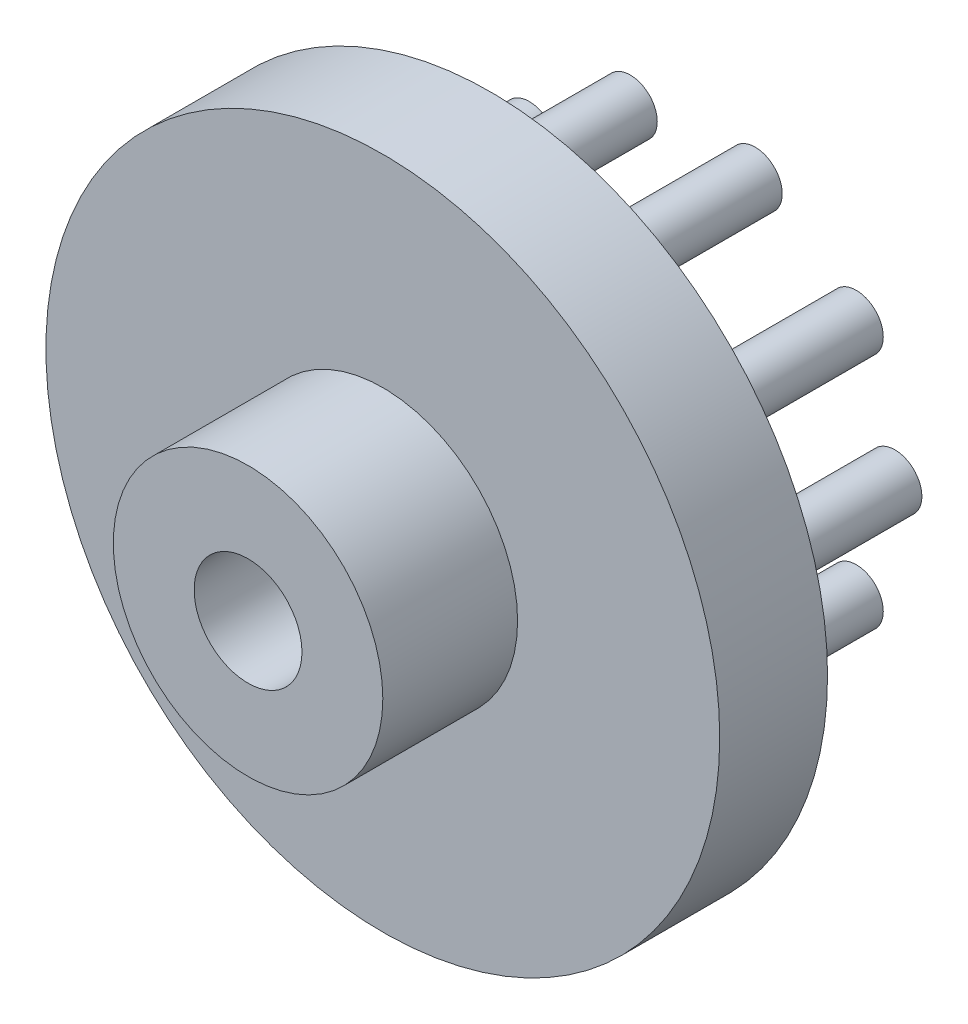
ISO-10303-21;
HEADER;
FILE_DESCRIPTION(('STEP AP214'),'2;1');
FILE_NAME('part.step','',(''),(''),'','','');
FILE_SCHEMA(('AUTOMOTIVE_DESIGN { 1 0 10303 214 1 1 1 1 }'));
ENDSEC;
DATA;
#1=APPLICATION_CONTEXT('core data for automotive mechanical design processes');
#2=APPLICATION_PROTOCOL_DEFINITION('international standard','automotive_design',2000,#1);
#3=PRODUCT_CONTEXT('',#1,'mechanical');
#4=PRODUCT('Part','Part','',(#3));
#5=PRODUCT_RELATED_PRODUCT_CATEGORY('part','',(#4));
#6=PRODUCT_DEFINITION_FORMATION('','',#4);
#7=PRODUCT_DEFINITION_CONTEXT('part definition',#1,'design');
#8=PRODUCT_DEFINITION('design','',#6,#7);
#9=PRODUCT_DEFINITION_SHAPE('','',#8);
#10=(LENGTH_UNIT() NAMED_UNIT(*) SI_UNIT(.MILLI.,.METRE.));
#11=(NAMED_UNIT(*) PLANE_ANGLE_UNIT() SI_UNIT($,.RADIAN.));
#12=(NAMED_UNIT(*) SI_UNIT($,.STERADIAN.) SOLID_ANGLE_UNIT());
#13=UNCERTAINTY_MEASURE_WITH_UNIT(LENGTH_MEASURE(1.E-05),#10,'distance_accuracy_value','');
#14=(GEOMETRIC_REPRESENTATION_CONTEXT(3) GLOBAL_UNCERTAINTY_ASSIGNED_CONTEXT((#13)) GLOBAL_UNIT_ASSIGNED_CONTEXT((#10,
#11,#12)) REPRESENTATION_CONTEXT('',''));
#15=CARTESIAN_POINT('',(0.,0.,0.));
#16=DIRECTION('',(0.,0.,1.));
#17=DIRECTION('',(1.,0.,0.));
#18=AXIS2_PLACEMENT_3D('',#15,#16,#17);
#19=CARTESIAN_POINT('',(0.,0.,8.));
#20=DIRECTION('',(0.,0.,1.));
#21=DIRECTION('',(1.,0.,0.));
#22=AXIS2_PLACEMENT_3D('',#19,#20,#21);
#23=PLANE('',#22);
#24=CARTESIAN_POINT('',(0.,0.,8.));
#25=DIRECTION('',(0.,0.,1.));
#26=DIRECTION('',(1.,0.,0.));
#27=AXIS2_PLACEMENT_3D('',#24,#25,#26);
#28=CIRCLE('',#27,25.);
#29=CARTESIAN_POINT('',(25.,0.,8.));
#30=VERTEX_POINT('',#29);
#31=EDGE_CURVE('E75',#30,#30,#28,.T.);
#32=ORIENTED_EDGE('',*,*,#31,.T.);
#33=EDGE_LOOP('',(#32));
#34=FACE_BOUND('',#33,.T.);
#35=CARTESIAN_POINT('',(0.,0.,8.));
#36=DIRECTION('',(0.,0.,1.));
#37=DIRECTION('',(1.,0.,0.));
#38=AXIS2_PLACEMENT_3D('',#35,#36,#37);
#39=CIRCLE('',#38,10.);
#40=CARTESIAN_POINT('',(10.,0.,8.));
#41=VERTEX_POINT('',#40);
#42=EDGE_CURVE('E111',#41,#41,#39,.T.);
#43=ORIENTED_EDGE('',*,*,#42,.F.);
#44=EDGE_LOOP('',(#43));
#45=FACE_BOUND('',#44,.T.);
#46=ADVANCED_FACE('F37',(#34,#45),#23,.T.);
#47=CARTESIAN_POINT('',(0.,0.,8.));
#48=DIRECTION('',(0.,0.,-1.));
#49=DIRECTION('',(-1.,0.,0.));
#50=AXIS2_PLACEMENT_3D('',#47,#48,#49);
#51=CYLINDRICAL_SURFACE('',#50,25.);
#52=ORIENTED_EDGE('',*,*,#31,.F.);
#53=EDGE_LOOP('',(#52));
#54=FACE_BOUND('',#53,.T.);
#55=CARTESIAN_POINT('',(0.,0.,0.));
#56=DIRECTION('',(0.,0.,1.));
#57=DIRECTION('',(1.,0.,0.));
#58=AXIS2_PLACEMENT_3D('',#55,#56,#57);
#59=CIRCLE('',#58,25.);
#60=CARTESIAN_POINT('',(25.,0.,0.));
#61=VERTEX_POINT('',#60);
#62=EDGE_CURVE('E76',#61,#61,#59,.T.);
#63=ORIENTED_EDGE('',*,*,#62,.T.);
#64=EDGE_LOOP('',(#63));
#65=FACE_BOUND('',#64,.T.);
#66=ADVANCED_FACE('F39',(#54,#65),#51,.T.);
#67=CARTESIAN_POINT('',(0.,0.,0.));
#68=DIRECTION('',(0.,0.,1.));
#69=DIRECTION('',(1.,0.,0.));
#70=AXIS2_PLACEMENT_3D('',#67,#68,#69);
#71=PLANE('',#70);
#72=CARTESIAN_POINT('',(0.,0.,0.));
#73=DIRECTION('',(0.,0.,1.));
#74=DIRECTION('',(1.,0.,0.));
#75=AXIS2_PLACEMENT_3D('',#72,#73,#74);
#76=CIRCLE('',#75,4.);
#77=CARTESIAN_POINT('',(4.,0.,0.));
#78=VERTEX_POINT('',#77);
#79=EDGE_CURVE('E41',#78,#78,#76,.T.);
#80=ORIENTED_EDGE('',*,*,#79,.T.);
#81=EDGE_LOOP('',(#80));
#82=FACE_BOUND('',#81,.T.);
#83=CARTESIAN_POINT('',(-12.1352549156243,8.81677878438694,0.));
#84=DIRECTION('',(0.,0.,1.));
#85=DIRECTION('',(1.,0.,0.));
#86=AXIS2_PLACEMENT_3D('',#83,#84,#85);
#87=CIRCLE('',#86,2.);
#88=CARTESIAN_POINT('',(-10.1352549156243,8.81677878438694,0.));
#89=VERTEX_POINT('',#88);
#90=EDGE_CURVE('E10',#89,#89,#87,.F.);
#91=ORIENTED_EDGE('',*,*,#90,.F.);
#92=EDGE_LOOP('',(#91));
#93=FACE_BOUND('',#92,.T.);
#94=CARTESIAN_POINT('',(-4.63525491562437,14.2658477444273,0.));
#95=DIRECTION('',(0.,0.,1.));
#96=DIRECTION('',(1.,0.,0.));
#97=AXIS2_PLACEMENT_3D('',#94,#95,#96);
#98=CIRCLE('',#97,2.);
#99=CARTESIAN_POINT('',(-2.63525491562437,14.2658477444273,0.));
#100=VERTEX_POINT('',#99);
#101=EDGE_CURVE('E45',#100,#100,#98,.F.);
#102=ORIENTED_EDGE('',*,*,#101,.F.);
#103=EDGE_LOOP('',(#102));
#104=FACE_BOUND('',#103,.T.);
#105=CARTESIAN_POINT('',(4.63525491562407,14.2658477444273,0.));
#106=DIRECTION('',(0.,0.,1.));
#107=DIRECTION('',(1.,0.,0.));
#108=AXIS2_PLACEMENT_3D('',#105,#106,#107);
#109=CIRCLE('',#108,2.);
#110=CARTESIAN_POINT('',(6.63525491562408,14.2658477444273,0.));
#111=VERTEX_POINT('',#110);
#112=EDGE_CURVE('E49',#111,#111,#109,.F.);
#113=ORIENTED_EDGE('',*,*,#112,.F.);
#114=EDGE_LOOP('',(#113));
#115=FACE_BOUND('',#114,.T.);
#116=CARTESIAN_POINT('',(12.1352549156241,8.8167787843872,0.));
#117=DIRECTION('',(0.,0.,1.));
#118=DIRECTION('',(1.,0.,0.));
#119=AXIS2_PLACEMENT_3D('',#116,#117,#118);
#120=CIRCLE('',#119,2.);
#121=CARTESIAN_POINT('',(14.1352549156241,8.8167787843872,0.));
#122=VERTEX_POINT('',#121);
#123=EDGE_CURVE('E54',#122,#122,#120,.F.);
#124=ORIENTED_EDGE('',*,*,#123,.F.);
#125=EDGE_LOOP('',(#124));
#126=FACE_BOUND('',#125,.T.);
#127=CARTESIAN_POINT('',(15.,1.04744440165294E-13,0.));
#128=DIRECTION('',(0.,0.,1.));
#129=DIRECTION('',(1.,0.,0.));
#130=AXIS2_PLACEMENT_3D('',#127,#128,#129);
#131=CIRCLE('',#130,2.);
#132=CARTESIAN_POINT('',(17.,1.04744440165294E-13,0.));
#133=VERTEX_POINT('',#132);
#134=EDGE_CURVE('E57',#133,#133,#131,.F.);
#135=ORIENTED_EDGE('',*,*,#134,.F.);
#136=EDGE_LOOP('',(#135));
#137=FACE_BOUND('',#136,.T.);
#138=CARTESIAN_POINT('',(12.1352549156243,-8.81677878438703,0.));
#139=DIRECTION('',(0.,0.,1.));
#140=DIRECTION('',(1.,0.,0.));
#141=AXIS2_PLACEMENT_3D('',#138,#139,#140);
#142=CIRCLE('',#141,2.);
#143=CARTESIAN_POINT('',(14.1352549156243,-8.81677878438703,0.));
#144=VERTEX_POINT('',#143);
#145=EDGE_CURVE('E60',#144,#144,#142,.F.);
#146=ORIENTED_EDGE('',*,*,#145,.F.);
#147=EDGE_LOOP('',(#146));
#148=FACE_BOUND('',#147,.T.);
#149=CARTESIAN_POINT('',(4.63525491562427,-14.2658477444273,0.));
#150=DIRECTION('',(0.,0.,1.));
#151=DIRECTION('',(1.,0.,0.));
#152=AXIS2_PLACEMENT_3D('',#149,#150,#151);
#153=CIRCLE('',#152,2.00000000000001);
#154=CARTESIAN_POINT('',(6.63525491562428,-14.2658477444273,0.));
#155=VERTEX_POINT('',#154);
#156=EDGE_CURVE('E63',#155,#155,#153,.F.);
#157=ORIENTED_EDGE('',*,*,#156,.F.);
#158=EDGE_LOOP('',(#157));
#159=FACE_BOUND('',#158,.T.);
#160=CARTESIAN_POINT('',(-4.63525491562417,-14.2658477444273,0.));
#161=DIRECTION('',(0.,0.,1.));
#162=DIRECTION('',(1.,0.,0.));
#163=AXIS2_PLACEMENT_3D('',#160,#161,#162);
#164=CIRCLE('',#163,2.);
#165=CARTESIAN_POINT('',(-2.63525491562417,-14.2658477444273,0.));
#166=VERTEX_POINT('',#165);
#167=EDGE_CURVE('E66',#166,#166,#164,.F.);
#168=ORIENTED_EDGE('',*,*,#167,.F.);
#169=EDGE_LOOP('',(#168));
#170=FACE_BOUND('',#169,.T.);
#171=CARTESIAN_POINT('',(-12.1352549156242,-8.81677878438711,0.));
#172=DIRECTION('',(0.,0.,1.));
#173=DIRECTION('',(1.,0.,0.));
#174=AXIS2_PLACEMENT_3D('',#171,#172,#173);
#175=CIRCLE('',#174,2.);
#176=CARTESIAN_POINT('',(-10.1352549156242,-8.81677878438711,0.));
#177=VERTEX_POINT('',#176);
#178=EDGE_CURVE('E69',#177,#177,#175,.F.);
#179=ORIENTED_EDGE('',*,*,#178,.F.);
#180=EDGE_LOOP('',(#179));
#181=FACE_BOUND('',#180,.T.);
#182=CARTESIAN_POINT('',(-15.,0.,0.));
#183=DIRECTION('',(0.,0.,1.));
#184=DIRECTION('',(1.,0.,0.));
#185=AXIS2_PLACEMENT_3D('',#182,#183,#184);
#186=CIRCLE('',#185,2.);
#187=CARTESIAN_POINT('',(-13.,0.,0.));
#188=VERTEX_POINT('',#187);
#189=EDGE_CURVE('E72',#188,#188,#186,.F.);
#190=ORIENTED_EDGE('',*,*,#189,.F.);
#191=EDGE_LOOP('',(#190));
#192=FACE_BOUND('',#191,.T.);
#193=ORIENTED_EDGE('',*,*,#62,.F.);
#194=EDGE_LOOP('',(#193));
#195=FACE_BOUND('',#194,.T.);
#196=ADVANCED_FACE('F144',(#82,#93,#104,#115,#126,#137,#148,#159,#170,#181,#192,#195),#71,.F.);
#197=CARTESIAN_POINT('',(-15.,0.,-15.));
#198=DIRECTION('',(0.,0.,1.));
#199=DIRECTION('',(1.,0.,0.));
#200=AXIS2_PLACEMENT_3D('',#197,#198,#199);
#201=CYLINDRICAL_SURFACE('',#200,2.);
#202=CARTESIAN_POINT('',(-15.,0.,-15.));
#203=DIRECTION('',(0.,0.,-1.));
#204=DIRECTION('',(-1.,0.,0.));
#205=AXIS2_PLACEMENT_3D('',#202,#203,#204);
#206=CIRCLE('',#205,2.);
#207=CARTESIAN_POINT('',(-17.,0.,-15.));
#208=VERTEX_POINT('',#207);
#209=EDGE_CURVE('E79',#208,#208,#206,.T.);
#210=ORIENTED_EDGE('',*,*,#209,.F.);
#211=EDGE_LOOP('',(#210));
#212=FACE_BOUND('',#211,.T.);
#213=ORIENTED_EDGE('',*,*,#189,.T.);
#214=EDGE_LOOP('',(#213));
#215=FACE_BOUND('',#214,.T.);
#216=ADVANCED_FACE('F148',(#212,#215),#201,.T.);
#217=CARTESIAN_POINT('',(-15.,0.,-15.));
#218=DIRECTION('',(0.,0.,-1.));
#219=DIRECTION('',(-1.,0.,0.));
#220=AXIS2_PLACEMENT_3D('',#217,#218,#219);
#221=PLANE('',#220);
#222=ORIENTED_EDGE('',*,*,#209,.T.);
#223=EDGE_LOOP('',(#222));
#224=FACE_BOUND('',#223,.T.);
#225=ADVANCED_FACE('F155',(#224),#221,.T.);
#226=CARTESIAN_POINT('',(-12.1352549156242,-8.81677878438711,-15.));
#227=DIRECTION('',(0.,0.,1.));
#228=DIRECTION('',(1.,0.,0.));
#229=AXIS2_PLACEMENT_3D('',#226,#227,#228);
#230=CYLINDRICAL_SURFACE('',#229,2.);
#231=CARTESIAN_POINT('',(-12.1352549156242,-8.81677878438711,-15.));
#232=DIRECTION('',(0.,0.,-1.));
#233=DIRECTION('',(-1.,0.,0.));
#234=AXIS2_PLACEMENT_3D('',#231,#232,#233);
#235=CIRCLE('',#234,2.);
#236=CARTESIAN_POINT('',(-14.1352549156242,-8.81677878438711,-15.));
#237=VERTEX_POINT('',#236);
#238=EDGE_CURVE('E84',#237,#237,#235,.T.);
#239=ORIENTED_EDGE('',*,*,#238,.F.);
#240=EDGE_LOOP('',(#239));
#241=FACE_BOUND('',#240,.T.);
#242=ORIENTED_EDGE('',*,*,#178,.T.);
#243=EDGE_LOOP('',(#242));
#244=FACE_BOUND('',#243,.T.);
#245=ADVANCED_FACE('F183',(#241,#244),#230,.T.);
#246=CARTESIAN_POINT('',(-12.1352549156242,-8.81677878438711,-15.));
#247=DIRECTION('',(0.,0.,-1.));
#248=DIRECTION('',(-1.,0.,0.));
#249=AXIS2_PLACEMENT_3D('',#246,#247,#248);
#250=PLANE('',#249);
#251=ORIENTED_EDGE('',*,*,#238,.T.);
#252=EDGE_LOOP('',(#251));
#253=FACE_BOUND('',#252,.T.);
#254=ADVANCED_FACE('F185',(#253),#250,.T.);
#255=CARTESIAN_POINT('',(-4.63525491562417,-14.2658477444273,-15.));
#256=DIRECTION('',(0.,0.,1.));
#257=DIRECTION('',(1.,0.,0.));
#258=AXIS2_PLACEMENT_3D('',#255,#256,#257);
#259=CYLINDRICAL_SURFACE('',#258,2.);
#260=CARTESIAN_POINT('',(-4.63525491562417,-14.2658477444273,-15.));
#261=DIRECTION('',(0.,0.,-1.));
#262=DIRECTION('',(-1.,0.,0.));
#263=AXIS2_PLACEMENT_3D('',#260,#261,#262);
#264=CIRCLE('',#263,2.);
#265=CARTESIAN_POINT('',(-6.63525491562418,-14.2658477444273,-15.));
#266=VERTEX_POINT('',#265);
#267=EDGE_CURVE('E87',#266,#266,#264,.T.);
#268=ORIENTED_EDGE('',*,*,#267,.F.);
#269=EDGE_LOOP('',(#268));
#270=FACE_BOUND('',#269,.T.);
#271=ORIENTED_EDGE('',*,*,#167,.T.);
#272=EDGE_LOOP('',(#271));
#273=FACE_BOUND('',#272,.T.);
#274=ADVANCED_FACE('F192',(#270,#273),#259,.T.);
#275=CARTESIAN_POINT('',(-4.63525491562417,-14.2658477444273,-15.));
#276=DIRECTION('',(0.,0.,-1.));
#277=DIRECTION('',(-1.,0.,0.));
#278=AXIS2_PLACEMENT_3D('',#275,#276,#277);
#279=PLANE('',#278);
#280=ORIENTED_EDGE('',*,*,#267,.T.);
#281=EDGE_LOOP('',(#280));
#282=FACE_BOUND('',#281,.T.);
#283=ADVANCED_FACE('F198',(#282),#279,.T.);
#284=CARTESIAN_POINT('',(4.63525491562427,-14.2658477444273,-15.));
#285=DIRECTION('',(0.,0.,1.));
#286=DIRECTION('',(1.,0.,0.));
#287=AXIS2_PLACEMENT_3D('',#284,#285,#286);
#288=CYLINDRICAL_SURFACE('',#287,2.00000000000001);
#289=CARTESIAN_POINT('',(4.63525491562427,-14.2658477444273,-15.));
#290=DIRECTION('',(0.,0.,-1.));
#291=DIRECTION('',(-1.,0.,0.));
#292=AXIS2_PLACEMENT_3D('',#289,#290,#291);
#293=CIRCLE('',#292,2.00000000000001);
#294=CARTESIAN_POINT('',(2.63525491562427,-14.2658477444273,-15.));
#295=VERTEX_POINT('',#294);
#296=EDGE_CURVE('E90',#295,#295,#293,.T.);
#297=ORIENTED_EDGE('',*,*,#296,.F.);
#298=EDGE_LOOP('',(#297));
#299=FACE_BOUND('',#298,.T.);
#300=ORIENTED_EDGE('',*,*,#156,.T.);
#301=EDGE_LOOP('',(#300));
#302=FACE_BOUND('',#301,.T.);
#303=ADVANCED_FACE('F201',(#299,#302),#288,.T.);
#304=CARTESIAN_POINT('',(4.63525491562427,-14.2658477444273,-15.));
#305=DIRECTION('',(0.,0.,-1.));
#306=DIRECTION('',(-1.,0.,0.));
#307=AXIS2_PLACEMENT_3D('',#304,#305,#306);
#308=PLANE('',#307);
#309=ORIENTED_EDGE('',*,*,#296,.T.);
#310=EDGE_LOOP('',(#309));
#311=FACE_BOUND('',#310,.T.);
#312=ADVANCED_FACE('F206',(#311),#308,.T.);
#313=CARTESIAN_POINT('',(12.1352549156243,-8.81677878438703,-15.));
#314=DIRECTION('',(0.,0.,1.));
#315=DIRECTION('',(1.,0.,0.));
#316=AXIS2_PLACEMENT_3D('',#313,#314,#315);
#317=CYLINDRICAL_SURFACE('',#316,2.);
#318=CARTESIAN_POINT('',(12.1352549156243,-8.81677878438703,-15.));
#319=DIRECTION('',(0.,0.,-1.));
#320=DIRECTION('',(-1.,0.,0.));
#321=AXIS2_PLACEMENT_3D('',#318,#319,#320);
#322=CIRCLE('',#321,2.);
#323=CARTESIAN_POINT('',(10.1352549156243,-8.81677878438703,-15.));
#324=VERTEX_POINT('',#323);
#325=EDGE_CURVE('E93',#324,#324,#322,.T.);
#326=ORIENTED_EDGE('',*,*,#325,.F.);
#327=EDGE_LOOP('',(#326));
#328=FACE_BOUND('',#327,.T.);
#329=ORIENTED_EDGE('',*,*,#145,.T.);
#330=EDGE_LOOP('',(#329));
#331=FACE_BOUND('',#330,.T.);
#332=ADVANCED_FACE('F209',(#328,#331),#317,.T.);
#333=CARTESIAN_POINT('',(12.1352549156243,-8.81677878438703,-15.));
#334=DIRECTION('',(0.,0.,-1.));
#335=DIRECTION('',(-1.,0.,0.));
#336=AXIS2_PLACEMENT_3D('',#333,#334,#335);
#337=PLANE('',#336);
#338=ORIENTED_EDGE('',*,*,#325,.T.);
#339=EDGE_LOOP('',(#338));
#340=FACE_BOUND('',#339,.T.);
#341=ADVANCED_FACE('F214',(#340),#337,.T.);
#342=CARTESIAN_POINT('',(15.,1.04744440165294E-13,-15.));
#343=DIRECTION('',(0.,0.,1.));
#344=DIRECTION('',(1.,0.,0.));
#345=AXIS2_PLACEMENT_3D('',#342,#343,#344);
#346=CYLINDRICAL_SURFACE('',#345,2.);
#347=CARTESIAN_POINT('',(15.,1.04744440165294E-13,-15.));
#348=DIRECTION('',(0.,0.,-1.));
#349=DIRECTION('',(-1.,0.,0.));
#350=AXIS2_PLACEMENT_3D('',#347,#348,#349);
#351=CIRCLE('',#350,2.);
#352=CARTESIAN_POINT('',(13.,1.04744440165294E-13,-15.));
#353=VERTEX_POINT('',#352);
#354=EDGE_CURVE('E96',#353,#353,#351,.T.);
#355=ORIENTED_EDGE('',*,*,#354,.F.);
#356=EDGE_LOOP('',(#355));
#357=FACE_BOUND('',#356,.T.);
#358=ORIENTED_EDGE('',*,*,#134,.T.);
#359=EDGE_LOOP('',(#358));
#360=FACE_BOUND('',#359,.T.);
#361=ADVANCED_FACE('F217',(#357,#360),#346,.T.);
#362=CARTESIAN_POINT('',(15.,1.04744440165294E-13,-15.));
#363=DIRECTION('',(0.,0.,-1.));
#364=DIRECTION('',(-1.,0.,0.));
#365=AXIS2_PLACEMENT_3D('',#362,#363,#364);
#366=PLANE('',#365);
#367=ORIENTED_EDGE('',*,*,#354,.T.);
#368=EDGE_LOOP('',(#367));
#369=FACE_BOUND('',#368,.T.);
#370=ADVANCED_FACE('F222',(#369),#366,.T.);
#371=CARTESIAN_POINT('',(12.1352549156241,8.8167787843872,-15.));
#372=DIRECTION('',(0.,0.,1.));
#373=DIRECTION('',(1.,0.,0.));
#374=AXIS2_PLACEMENT_3D('',#371,#372,#373);
#375=CYLINDRICAL_SURFACE('',#374,2.);
#376=CARTESIAN_POINT('',(12.1352549156241,8.8167787843872,-15.));
#377=DIRECTION('',(0.,0.,-1.));
#378=DIRECTION('',(-1.,0.,0.));
#379=AXIS2_PLACEMENT_3D('',#376,#377,#378);
#380=CIRCLE('',#379,2.);
#381=CARTESIAN_POINT('',(10.1352549156241,8.8167787843872,-15.));
#382=VERTEX_POINT('',#381);
#383=EDGE_CURVE('E99',#382,#382,#380,.T.);
#384=ORIENTED_EDGE('',*,*,#383,.F.);
#385=EDGE_LOOP('',(#384));
#386=FACE_BOUND('',#385,.T.);
#387=ORIENTED_EDGE('',*,*,#123,.T.);
#388=EDGE_LOOP('',(#387));
#389=FACE_BOUND('',#388,.T.);
#390=ADVANCED_FACE('F225',(#386,#389),#375,.T.);
#391=CARTESIAN_POINT('',(12.1352549156241,8.8167787843872,-15.));
#392=DIRECTION('',(0.,0.,-1.));
#393=DIRECTION('',(-1.,0.,0.));
#394=AXIS2_PLACEMENT_3D('',#391,#392,#393);
#395=PLANE('',#394);
#396=ORIENTED_EDGE('',*,*,#383,.T.);
#397=EDGE_LOOP('',(#396));
#398=FACE_BOUND('',#397,.T.);
#399=ADVANCED_FACE('F230',(#398),#395,.T.);
#400=CARTESIAN_POINT('',(4.63525491562407,14.2658477444273,-15.));
#401=DIRECTION('',(0.,0.,1.));
#402=DIRECTION('',(1.,0.,0.));
#403=AXIS2_PLACEMENT_3D('',#400,#401,#402);
#404=CYLINDRICAL_SURFACE('',#403,2.);
#405=CARTESIAN_POINT('',(4.63525491562407,14.2658477444273,-15.));
#406=DIRECTION('',(0.,0.,-1.));
#407=DIRECTION('',(-1.,0.,0.));
#408=AXIS2_PLACEMENT_3D('',#405,#406,#407);
#409=CIRCLE('',#408,2.);
#410=CARTESIAN_POINT('',(2.63525491562407,14.2658477444273,-15.));
#411=VERTEX_POINT('',#410);
#412=EDGE_CURVE('E102',#411,#411,#409,.T.);
#413=ORIENTED_EDGE('',*,*,#412,.F.);
#414=EDGE_LOOP('',(#413));
#415=FACE_BOUND('',#414,.T.);
#416=ORIENTED_EDGE('',*,*,#112,.T.);
#417=EDGE_LOOP('',(#416));
#418=FACE_BOUND('',#417,.T.);
#419=ADVANCED_FACE('F233',(#415,#418),#404,.T.);
#420=CARTESIAN_POINT('',(4.63525491562407,14.2658477444273,-15.));
#421=DIRECTION('',(0.,0.,-1.));
#422=DIRECTION('',(-1.,0.,0.));
#423=AXIS2_PLACEMENT_3D('',#420,#421,#422);
#424=PLANE('',#423);
#425=ORIENTED_EDGE('',*,*,#412,.T.);
#426=EDGE_LOOP('',(#425));
#427=FACE_BOUND('',#426,.T.);
#428=ADVANCED_FACE('F238',(#427),#424,.T.);
#429=CARTESIAN_POINT('',(-4.63525491562437,14.2658477444273,-15.));
#430=DIRECTION('',(0.,0.,1.));
#431=DIRECTION('',(1.,0.,0.));
#432=AXIS2_PLACEMENT_3D('',#429,#430,#431);
#433=CYLINDRICAL_SURFACE('',#432,2.);
#434=CARTESIAN_POINT('',(-4.63525491562437,14.2658477444273,-15.));
#435=DIRECTION('',(0.,0.,-1.));
#436=DIRECTION('',(-1.,0.,0.));
#437=AXIS2_PLACEMENT_3D('',#434,#435,#436);
#438=CIRCLE('',#437,2.);
#439=CARTESIAN_POINT('',(-6.63525491562438,14.2658477444273,-15.));
#440=VERTEX_POINT('',#439);
#441=EDGE_CURVE('E105',#440,#440,#438,.T.);
#442=ORIENTED_EDGE('',*,*,#441,.F.);
#443=EDGE_LOOP('',(#442));
#444=FACE_BOUND('',#443,.T.);
#445=ORIENTED_EDGE('',*,*,#101,.T.);
#446=EDGE_LOOP('',(#445));
#447=FACE_BOUND('',#446,.T.);
#448=ADVANCED_FACE('F241',(#444,#447),#433,.T.);
#449=CARTESIAN_POINT('',(-4.63525491562437,14.2658477444273,-15.));
#450=DIRECTION('',(0.,0.,-1.));
#451=DIRECTION('',(-1.,0.,0.));
#452=AXIS2_PLACEMENT_3D('',#449,#450,#451);
#453=PLANE('',#452);
#454=ORIENTED_EDGE('',*,*,#441,.T.);
#455=EDGE_LOOP('',(#454));
#456=FACE_BOUND('',#455,.T.);
#457=ADVANCED_FACE('F246',(#456),#453,.T.);
#458=CARTESIAN_POINT('',(-12.1352549156243,8.81677878438694,-15.));
#459=DIRECTION('',(0.,0.,1.));
#460=DIRECTION('',(1.,0.,0.));
#461=AXIS2_PLACEMENT_3D('',#458,#459,#460);
#462=CYLINDRICAL_SURFACE('',#461,2.);
#463=CARTESIAN_POINT('',(-12.1352549156243,8.81677878438694,-15.));
#464=DIRECTION('',(0.,0.,-1.));
#465=DIRECTION('',(-1.,0.,0.));
#466=AXIS2_PLACEMENT_3D('',#463,#464,#465);
#467=CIRCLE('',#466,2.);
#468=CARTESIAN_POINT('',(-14.1352549156243,8.81677878438694,-15.));
#469=VERTEX_POINT('',#468);
#470=EDGE_CURVE('E108',#469,#469,#467,.T.);
#471=ORIENTED_EDGE('',*,*,#470,.F.);
#472=EDGE_LOOP('',(#471));
#473=FACE_BOUND('',#472,.T.);
#474=ORIENTED_EDGE('',*,*,#90,.T.);
#475=EDGE_LOOP('',(#474));
#476=FACE_BOUND('',#475,.T.);
#477=ADVANCED_FACE('F249',(#473,#476),#462,.T.);
#478=CARTESIAN_POINT('',(-12.1352549156243,8.81677878438694,-15.));
#479=DIRECTION('',(0.,0.,-1.));
#480=DIRECTION('',(-1.,0.,0.));
#481=AXIS2_PLACEMENT_3D('',#478,#479,#480);
#482=PLANE('',#481);
#483=ORIENTED_EDGE('',*,*,#470,.T.);
#484=EDGE_LOOP('',(#483));
#485=FACE_BOUND('',#484,.T.);
#486=ADVANCED_FACE('F134',(#485),#482,.T.);
#487=CARTESIAN_POINT('',(0.,0.,8.));
#488=DIRECTION('',(0.,0.,-1.));
#489=DIRECTION('',(-1.,0.,0.));
#490=AXIS2_PLACEMENT_3D('',#487,#488,#489);
#491=CYLINDRICAL_SURFACE('',#490,4.);
#492=ORIENTED_EDGE('',*,*,#79,.F.);
#493=EDGE_LOOP('',(#492));
#494=FACE_BOUND('',#493,.T.);
#495=CARTESIAN_POINT('',(0.,0.,18.));
#496=DIRECTION('',(0.,0.,1.));
#497=DIRECTION('',(1.,0.,0.));
#498=AXIS2_PLACEMENT_3D('',#495,#496,#497);
#499=CIRCLE('',#498,4.);
#500=CARTESIAN_POINT('',(4.,0.,18.));
#501=VERTEX_POINT('',#500);
#502=EDGE_CURVE('E115',#501,#501,#499,.T.);
#503=ORIENTED_EDGE('',*,*,#502,.T.);
#504=EDGE_LOOP('',(#503));
#505=FACE_BOUND('',#504,.T.);
#506=ADVANCED_FACE('F121',(#494,#505),#491,.F.);
#507=CARTESIAN_POINT('',(0.,0.,18.));
#508=DIRECTION('',(0.,0.,1.));
#509=DIRECTION('',(1.,0.,0.));
#510=AXIS2_PLACEMENT_3D('',#507,#508,#509);
#511=PLANE('',#510);
#512=CARTESIAN_POINT('',(0.,0.,18.));
#513=DIRECTION('',(0.,0.,1.));
#514=DIRECTION('',(1.,0.,0.));
#515=AXIS2_PLACEMENT_3D('',#512,#513,#514);
#516=CIRCLE('',#515,10.);
#517=CARTESIAN_POINT('',(10.,0.,18.));
#518=VERTEX_POINT('',#517);
#519=EDGE_CURVE('E114',#518,#518,#516,.T.);
#520=ORIENTED_EDGE('',*,*,#519,.T.);
#521=EDGE_LOOP('',(#520));
#522=FACE_BOUND('',#521,.T.);
#523=ORIENTED_EDGE('',*,*,#502,.F.);
#524=EDGE_LOOP('',(#523));
#525=FACE_BOUND('',#524,.T.);
#526=ADVANCED_FACE('F123',(#522,#525),#511,.T.);
#527=CARTESIAN_POINT('',(0.,0.,18.));
#528=DIRECTION('',(0.,0.,-1.));
#529=DIRECTION('',(-1.,0.,0.));
#530=AXIS2_PLACEMENT_3D('',#527,#528,#529);
#531=CYLINDRICAL_SURFACE('',#530,10.);
#532=ORIENTED_EDGE('',*,*,#519,.F.);
#533=EDGE_LOOP('',(#532));
#534=FACE_BOUND('',#533,.T.);
#535=ORIENTED_EDGE('',*,*,#42,.T.);
#536=EDGE_LOOP('',(#535));
#537=FACE_BOUND('',#536,.T.);
#538=ADVANCED_FACE('F125',(#534,#537),#531,.T.);
#539=CLOSED_SHELL('',(#46,#66,#196,#216,#225,#245,#254,#274,#283,#303,#312,#332,#341,#361,#370,
#390,#399,#419,#428,#448,#457,#477,#486,#506,#526,#538));
#540=MANIFOLD_SOLID_BREP('B2',#539);
#541=ADVANCED_BREP_SHAPE_REPRESENTATION('',(#18,#540),#14);
#542=SHAPE_DEFINITION_REPRESENTATION(#9,#541);
ENDSEC;
END-ISO-10303-21;
